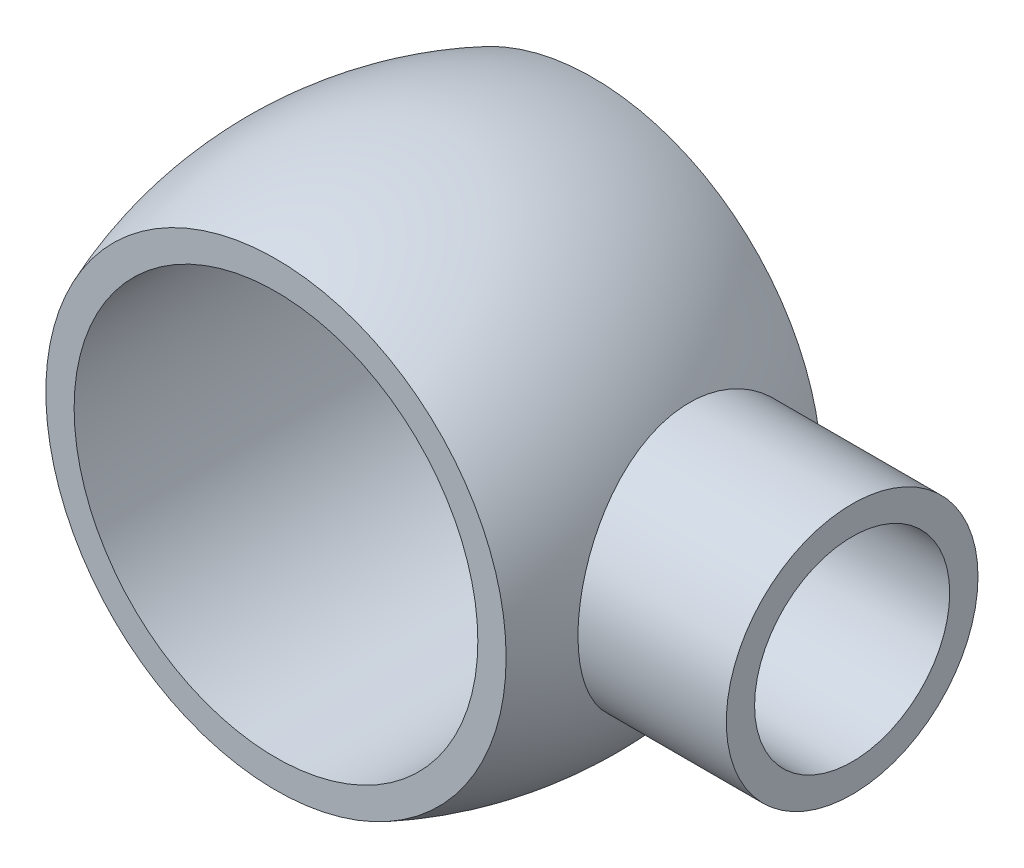
ISO-10303-21;
HEADER;
FILE_DESCRIPTION(('STEP AP214'),'2;1');
FILE_NAME('part.step','',(''),(''),'','','');
FILE_SCHEMA(('AUTOMOTIVE_DESIGN { 1 0 10303 214 1 1 1 1 }'));
ENDSEC;
DATA;
#1=APPLICATION_CONTEXT('core data for automotive mechanical design processes');
#2=APPLICATION_PROTOCOL_DEFINITION('international standard','automotive_design',2000,#1);
#3=PRODUCT_CONTEXT('',#1,'mechanical');
#4=PRODUCT('Part','Part','',(#3));
#5=PRODUCT_RELATED_PRODUCT_CATEGORY('part','',(#4));
#6=PRODUCT_DEFINITION_FORMATION('','',#4);
#7=PRODUCT_DEFINITION_CONTEXT('part definition',#1,'design');
#8=PRODUCT_DEFINITION('design','',#6,#7);
#9=PRODUCT_DEFINITION_SHAPE('','',#8);
#10=(LENGTH_UNIT() NAMED_UNIT(*) SI_UNIT(.MILLI.,.METRE.));
#11=(NAMED_UNIT(*) PLANE_ANGLE_UNIT() SI_UNIT($,.RADIAN.));
#12=(NAMED_UNIT(*) SI_UNIT($,.STERADIAN.) SOLID_ANGLE_UNIT());
#13=UNCERTAINTY_MEASURE_WITH_UNIT(LENGTH_MEASURE(1.E-05),#10,'distance_accuracy_value','');
#14=(GEOMETRIC_REPRESENTATION_CONTEXT(3) GLOBAL_UNCERTAINTY_ASSIGNED_CONTEXT((#13)) GLOBAL_UNIT_ASSIGNED_CONTEXT((#10,
#11,#12)) REPRESENTATION_CONTEXT('',''));
#15=CARTESIAN_POINT('',(0.,0.,0.));
#16=DIRECTION('',(0.,0.,1.));
#17=DIRECTION('',(1.,0.,0.));
#18=AXIS2_PLACEMENT_3D('',#15,#16,#17);
#19=CARTESIAN_POINT('',(0.,0.,-28.448));
#20=DIRECTION('',(0.,0.,-1.));
#21=DIRECTION('',(-1.,0.,0.));
#22=AXIS2_PLACEMENT_3D('',#19,#20,#21);
#23=PLANE('',#22);
#24=CARTESIAN_POINT('',(0.,0.,-28.448));
#25=DIRECTION('',(0.,0.,1.));
#26=DIRECTION('',(1.,0.,0.));
#27=AXIS2_PLACEMENT_3D('',#24,#25,#26);
#28=CIRCLE('',#27,36.2585);
#29=CARTESIAN_POINT('',(36.2585,0.,-28.448));
#30=VERTEX_POINT('',#29);
#31=EDGE_CURVE('E57',#30,#30,#28,.T.);
#32=ORIENTED_EDGE('',*,*,#31,.T.);
#33=EDGE_LOOP('',(#32));
#34=FACE_BOUND('',#33,.T.);
#35=CARTESIAN_POINT('',(0.,0.,-28.448));
#36=DIRECTION('',(0.,0.,1.));
#37=DIRECTION('',(1.,0.,0.));
#38=AXIS2_PLACEMENT_3D('',#35,#36,#37);
#39=CIRCLE('',#38,41.1132766541674);
#40=CARTESIAN_POINT('',(41.1132766541674,0.,-28.448));
#41=VERTEX_POINT('',#40);
#42=EDGE_CURVE('E62',#41,#41,#39,.T.);
#43=ORIENTED_EDGE('',*,*,#42,.F.);
#44=EDGE_LOOP('',(#43));
#45=FACE_BOUND('',#44,.T.);
#46=ADVANCED_FACE('F37',(#34,#45),#23,.T.);
#47=CARTESIAN_POINT('',(0.,0.,0.279826581228208));
#48=DIRECTION('',(0.,0.,1.));
#49=DIRECTION('',(1.,0.,0.));
#50=AXIS2_PLACEMENT_3D('',#47,#48,#49);
#51=DEGENERATE_TOROIDAL_SURFACE('',#50,29.464,76.2,.F.);
#52=CARTESIAN_POINT('',(43.1603121786938,-12.4393993128797,-16.2695883976753));
#53=CARTESIAN_POINT('',(43.1413822338452,-12.7841490575141,-15.9222381524418));
#54=CARTESIAN_POINT('',(43.123399931474,-13.1142930353611,-15.5604788709335));
#55=CARTESIAN_POINT('',(43.0902791287243,-13.7433122747584,-14.8104171236534));
#56=CARTESIAN_POINT('',(43.0751411768528,-14.0421815003467,-14.4221095579393));
#57=CARTESIAN_POINT('',(43.0486160935451,-14.6066384657564,-13.6214373372335));
#58=CARTESIAN_POINT('',(43.0372319952719,-14.8721991850462,-13.2090535434468));
#59=CARTESIAN_POINT('',(43.019059762729,-15.3678617205108,-12.3634240462649));
#60=CARTESIAN_POINT('',(43.0122713994767,-15.597965302897,-11.9301793834153));
#61=CARTESIAN_POINT('',(43.0040059273466,-16.0210740236935,-11.0458840477513));
#62=CARTESIAN_POINT('',(43.0025288579481,-16.2140788863361,-10.5948332426078));
#63=CARTESIAN_POINT('',(43.005463744434,-16.5616042050872,-9.67815195015388));
#64=CARTESIAN_POINT('',(43.0098757700079,-16.7161242057525,-9.21252129037379));
#65=CARTESIAN_POINT('',(43.0250051171025,-16.9855470434209,-8.2701474575391));
#66=CARTESIAN_POINT('',(43.0357210363975,-17.1004586818174,-7.79340677841715));
#67=CARTESIAN_POINT('',(43.0636988005645,-17.2899172038218,-6.8321630383389));
#68=CARTESIAN_POINT('',(43.0809606001094,-17.3644643669254,-6.34766003115521));
#69=CARTESIAN_POINT('',(43.121975326741,-17.4724233296553,-5.37702000721974));
#70=CARTESIAN_POINT('',(43.1456927291487,-17.5060549006414,-4.89090591060219));
#71=CARTESIAN_POINT('',(43.19952947992,-17.5327549300431,-3.9179224460597));
#72=CARTESIAN_POINT('',(43.2296488061444,-17.5258235287319,-3.43105308075242));
#73=CARTESIAN_POINT('',(43.2959820480743,-17.4715426114785,-2.45997187524868));
#74=CARTESIAN_POINT('',(43.3321962335966,-17.4241913057866,-1.97576015368534));
#75=CARTESIAN_POINT('',(43.410239656935,-17.289508297146,-1.0133892935498));
#76=CARTESIAN_POINT('',(43.4520689264363,-17.2021763685857,-0.535230189148312));
#77=CARTESIAN_POINT('',(43.5408923426659,-16.9878059106755,0.413705346150005));
#78=CARTESIAN_POINT('',(43.5879071151687,-16.8606048154592,0.884443111152988));
#79=CARTESIAN_POINT('',(43.6861803975891,-16.567598008645,1.81328711156837));
#80=CARTESIAN_POINT('',(43.7374389142139,-16.4017922360313,2.27139332701495));
#81=CARTESIAN_POINT('',(43.8433079445948,-16.0327853927215,3.17192377755698));
#82=CARTESIAN_POINT('',(43.897918703202,-15.8295815882643,3.61434686340884));
#83=CARTESIAN_POINT('',(44.009499612589,-15.3872277560815,4.48053205019941));
#84=CARTESIAN_POINT('',(44.0664697882703,-15.1480773489032,4.90429395408945));
#85=CARTESIAN_POINT('',(44.1825370264354,-14.6317933714797,5.73628128093671));
#86=CARTESIAN_POINT('',(44.2416528779105,-14.3541640141833,6.14419651543433));
#87=CARTESIAN_POINT('',(44.3600661695293,-13.7655271189254,6.93516313403366));
#88=CARTESIAN_POINT('',(44.4193636114548,-13.4545192524161,7.31821427333618));
#89=CARTESIAN_POINT('',(44.5369618020648,-12.8012237661529,8.05684579774082));
#90=CARTESIAN_POINT('',(44.5952625003648,-12.4589345706746,8.41242479733089));
#91=CARTESIAN_POINT('',(44.7096822070007,-11.7453999429631,9.09362171449635));
#92=CARTESIAN_POINT('',(44.7658012142713,-11.374154496592,9.41923961744299));
#93=CARTESIAN_POINT('',(44.8750182741524,-10.6029643079104,10.0400198652633));
#94=CARTESIAN_POINT('',(44.9280967640446,-10.2028645810448,10.334993184919));
#95=CARTESIAN_POINT('',(45.0297476645814,-9.37865568639202,10.8901327143833));
#96=CARTESIAN_POINT('',(45.0783200476117,-8.95454637149593,11.1502987108915));
#97=CARTESIAN_POINT('',(45.1699048295993,-8.08530572463559,11.6338439617367));
#98=CARTESIAN_POINT('',(45.2129175625603,-7.64017565771835,11.8572254261776));
#99=CARTESIAN_POINT('',(45.2924388343674,-6.73203407025935,12.2654822283076));
#100=CARTESIAN_POINT('',(45.328947463338,-6.26902279759801,12.4503580995582));
#101=CARTESIAN_POINT('',(45.3942207726193,-5.33452567607111,12.7780047750319));
#102=CARTESIAN_POINT('',(45.4230790933663,-4.86322565567117,12.9212869754046));
#103=CARTESIAN_POINT('',(45.4730237716509,-3.90984826597138,13.1677493084902));
#104=CARTESIAN_POINT('',(45.4941101865628,-3.42777097626014,13.2709297372456));
#105=CARTESIAN_POINT('',(45.5280372252163,-2.45640281079914,13.4363391040699));
#106=CARTESIAN_POINT('',(45.5408786759184,-1.96711266352802,13.49857214913));
#107=CARTESIAN_POINT('',(45.5580290695727,-0.984881371785242,13.581587673435));
#108=CARTESIAN_POINT('',(45.5623381104552,-0.491940269282411,13.6023706284212));
#109=CARTESIAN_POINT('',(45.5623268342831,0.485366673651553,13.6023156878541));
#110=CARTESIAN_POINT('',(45.5581551318467,0.96973271475107,13.5821945857838));
#111=CARTESIAN_POINT('',(45.5415713971376,1.9349893895929,13.5019283429501));
#112=CARTESIAN_POINT('',(45.5291594717976,2.41588006835284,13.4417837215689));
#113=CARTESIAN_POINT('',(45.496366156617,3.37075674611305,13.2819527522765));
#114=CARTESIAN_POINT('',(45.4759849035599,3.84474286347673,13.1822670830381));
#115=CARTESIAN_POINT('',(45.4276936295133,4.78248365623515,12.9441390428942));
#116=CARTESIAN_POINT('',(45.3997835729899,5.24623828332903,12.8056964890673));
#117=CARTESIAN_POINT('',(45.3370585061375,6.15990375554059,12.4912593135974));
#118=CARTESIAN_POINT('',(45.3022494380327,6.60982613202078,12.3152969984765));
#119=CARTESIAN_POINT('',(45.2264441748429,7.49317981548803,11.9270745760422));
#120=CARTESIAN_POINT('',(45.1854479975888,7.92661116999654,11.7148145733361));
#121=CARTESIAN_POINT('',(45.0981146124393,8.77411900629546,11.2555337144418));
#122=CARTESIAN_POINT('',(45.0517770299523,9.18819412777142,11.0085104200424));
#123=CARTESIAN_POINT('',(44.9547066656505,9.99424141561001,10.4814703470165));
#124=CARTESIAN_POINT('',(44.9039738242078,10.3862132819914,10.2014531207618));
#125=CARTESIAN_POINT('',(44.7982612231518,11.1517922893715,9.60547445440995));
#126=CARTESIAN_POINT('',(44.7432251240459,11.5249887560021,9.28899536630632));
#127=CARTESIAN_POINT('',(44.6307787605653,12.2434393444088,8.62615410358728));
#128=CARTESIAN_POINT('',(44.5733684723687,12.5886931857124,8.27979162909127));
#129=CARTESIAN_POINT('',(44.4573156911245,13.2489989650672,7.55952273325268));
#130=CARTESIAN_POINT('',(44.3986730964071,13.5640483991187,7.18561403281465));
#131=CARTESIAN_POINT('',(44.2813114675746,14.1618154937612,6.41279813193527));
#132=CARTESIAN_POINT('',(44.2225924329185,14.44453292428,6.01389075363628));
#133=CARTESIAN_POINT('',(44.1053706835193,14.979557118483,5.18782867045793));
#134=CARTESIAN_POINT('',(44.0468832884731,15.2313667641714,4.76034966945782));
#135=CARTESIAN_POINT('',(43.9321317666932,15.6979599219389,3.88534852237713));
#136=CARTESIAN_POINT('',(43.8758676645063,15.9127430253055,3.43782615511924));
#137=CARTESIAN_POINT('',(43.7666300129073,16.3037054121172,2.52583921196006));
#138=CARTESIAN_POINT('',(43.7136564278049,16.4798851143231,2.06137481990569));
#139=CARTESIAN_POINT('',(43.6119694799914,16.7923010135292,1.11874659715292));
#140=CARTESIAN_POINT('',(43.5632560844942,16.9285375179474,0.64058287192085));
#141=CARTESIAN_POINT('',(43.4711071585317,17.1595554108494,-0.32428088015757));
#142=CARTESIAN_POINT('',(43.4276528681552,17.2544874850479,-0.81094302512437));
#143=CARTESIAN_POINT('',(43.3465093061573,17.4028227556151,-1.7910349758521));
#144=CARTESIAN_POINT('',(43.3088200306101,17.4562259802639,-2.28446477700419));
#145=CARTESIAN_POINT('',(43.2397389868423,17.5209960494837,-3.27447805857188));
#146=CARTESIAN_POINT('',(43.2083467248076,17.5323661915253,-3.77106128854109));
#147=CARTESIAN_POINT('',(43.1522036207596,17.5128905213501,-4.76377440438291));
#148=CARTESIAN_POINT('',(43.127452702159,17.4820451959833,-5.25990429541763));
#149=CARTESIAN_POINT('',(43.0850531523149,17.3790322736294,-6.24090578752679));
#150=CARTESIAN_POINT('',(43.0673072055342,17.3074672693543,-6.72583654713037));
#151=CARTESIAN_POINT('',(43.0383716184629,17.1239289205765,-7.68818605300253));
#152=CARTESIAN_POINT('',(43.0271819144045,17.011955969109,-8.16560487229023));
#153=CARTESIAN_POINT('',(43.0111305471142,16.7483772027527,-9.10946655848653));
#154=CARTESIAN_POINT('',(43.0062687076418,16.5967724918091,-9.57590973072802));
#155=CARTESIAN_POINT('',(43.0024674065451,16.2550050959875,-10.4944732774221));
#156=CARTESIAN_POINT('',(43.0035279440486,16.0648424167887,-10.9465936539842));
#157=CARTESIAN_POINT('',(43.010984418936,15.6484835178556,-11.8308132035499));
#158=CARTESIAN_POINT('',(43.0173507452386,15.4224929059629,-12.2630094750342));
#159=CARTESIAN_POINT('',(43.0346861214565,14.9353374999397,-13.106999547539));
#160=CARTESIAN_POINT('',(43.045655148534,14.6741728803415,-13.5187934497815));
#161=CARTESIAN_POINT('',(43.0713902998829,14.1185034252804,-14.3191308336515));
#162=CARTESIAN_POINT('',(43.0861565699915,13.8239973095445,-14.7076734215805));
#163=CARTESIAN_POINT('',(43.1185953892356,13.2037161292881,-15.4588120486675));
#164=CARTESIAN_POINT('',(43.1362679595289,12.8779408371364,-15.8214078989069));
#165=CARTESIAN_POINT('',(43.1737067614802,12.1949603991845,-16.5206472697281));
#166=CARTESIAN_POINT('',(43.1934870101439,11.8375479000051,-16.8570875261574));
#167=CARTESIAN_POINT('',(43.2340452357928,11.0958054165953,-17.4987914183331));
#168=CARTESIAN_POINT('',(43.2548232168753,10.7114753218247,-17.8040549260359));
#169=CARTESIAN_POINT('',(43.2963928212259,9.9185642473451,-18.3812931894848));
#170=CARTESIAN_POINT('',(43.3171844448569,9.50998259423162,-18.653267020218));
#171=CARTESIAN_POINT('',(43.3578336412837,8.67141956780339,-19.1620186484544));
#172=CARTESIAN_POINT('',(43.3776912120823,8.24143814873479,-19.3987963707021));
#173=CARTESIAN_POINT('',(43.4156971874154,7.3606484512306,-19.8366939350191));
#174=CARTESIAN_POINT('',(43.4338355782942,6.90973852723211,-20.0376102471212));
#175=CARTESIAN_POINT('',(43.4674824757069,5.99249377007548,-20.4007318561513));
#176=CARTESIAN_POINT('',(43.4829909710038,5.52615887102027,-20.5629369876769));
#177=CARTESIAN_POINT('',(43.5107057486474,4.58140356611779,-20.8474503649449));
#178=CARTESIAN_POINT('',(43.5229122117844,4.10298382349923,-20.9697607950463));
#179=CARTESIAN_POINT('',(43.5435002300466,3.13745365787838,-21.1735992821733));
#180=CARTESIAN_POINT('',(43.5518818057565,2.65034328166189,-21.2551275586799));
#181=CARTESIAN_POINT('',(43.564439196169,1.67274989966487,-21.3765734600012));
#182=CARTESIAN_POINT('',(43.5686305374352,1.18228617603193,-21.4166447197207));
#183=CARTESIAN_POINT('',(43.5726850466647,0.199707168365994,-21.4554149040075));
#184=CARTESIAN_POINT('',(43.5725482109027,-0.292408117088135,-21.4541137929657));
#185=CARTESIAN_POINT('',(43.5679516869232,-1.27485423142427,-21.4101446817866));
#186=CARTESIAN_POINT('',(43.5634912293594,-1.76518472713401,-21.3674693195068));
#187=CARTESIAN_POINT('',(43.5504348431747,-2.74046080086136,-21.2410568275058));
#188=CARTESIAN_POINT('',(43.5418389673279,-3.2254064475171,-21.1573202217887));
#189=CARTESIAN_POINT('',(43.5209046046151,-4.18515311184183,-20.9496832144505));
#190=CARTESIAN_POINT('',(43.5085763826437,-4.65997817745005,-20.8258929072314));
#191=CARTESIAN_POINT('',(43.4806914926601,-5.59751368798929,-20.5389772673418));
#192=CARTESIAN_POINT('',(43.4651346718976,-6.06022355856364,-20.3758500735193));
#193=CARTESIAN_POINT('',(43.4314712187996,-6.96990372393707,-20.0115698620016));
#194=CARTESIAN_POINT('',(43.4133666729527,-7.41688652785141,-19.8104479148436));
#195=CARTESIAN_POINT('',(43.3753898689584,-8.29225818403341,-19.3715989417986));
#196=CARTESIAN_POINT('',(43.3555179519686,-8.7206506011705,-19.1338789740182));
#197=CARTESIAN_POINT('',(43.3060139974536,-9.73811146291184,-18.5121275943854));
#198=CARTESIAN_POINT('',(43.2759006931023,-10.3158953715289,-18.109466417359));
#199=CARTESIAN_POINT('',(43.2166440271184,-11.4189627825623,-17.2376412363612));
#200=CARTESIAN_POINT('',(43.1875006719128,-11.9442459371475,-16.7684767918382));
#201=CARTESIAN_POINT('',(43.1603121786938,-12.4393993128797,-16.2695883976753));
#202=B_SPLINE_CURVE_WITH_KNOTS('',3,(#52,#53,#54,#55,#56,#57,#58,#59,#60,#61,#62,#63,#64,#65,
#66,#67,#68,#69,#70,#71,#72,#73,#74,#75,#76,#77,#78,#79,#80,#81,#82,#83,#84,#85,#86,#87,#88,#89,
#90,#91,#92,#93,#94,#95,#96,#97,#98,#99,#100,#101,#102,#103,#104,#105,#106,#107,#108,#109,#110,
#111,#112,#113,#114,#115,#116,#117,#118,#119,#120,#121,#122,#123,#124,#125,#126,#127,#128,#129,
#130,#131,#132,#133,#134,#135,#136,#137,#138,#139,#140,#141,#142,#143,#144,#145,#146,#147,#148,
#149,#150,#151,#152,#153,#154,#155,#156,#157,#158,#159,#160,#161,#162,#163,#164,#165,#166,#167,
#168,#169,#170,#171,#172,#173,#174,#175,#176,#177,#178,#179,#180,#181,#182,#183,#184,#185,#186,
#187,#188,#189,#190,#191,#192,#193,#194,#195,#196,#197,#198,#199,#200,#201),.UNSPECIFIED.,.T.,
.F.,(4,2,2,2,2,2,2,2,2,2,2,2,2,2,2,2,2,2,2,2,2,2,2,2,2,2,2,2,2,2,2,2,2,2,2,2,2,2,2,2,2,2,2,2,2,
2,2,2,2,2,2,2,2,2,2,2,2,2,2,2,2,2,2,2,2,2,2,2,2,2,2,2,2,2,4),(0.,1.46867296499704,
2.93762886005812,4.40776879874042,5.87783548227106,7.34791309289609,8.81800810010744,
10.2877762258795,11.7575341744073,13.2193622013585,14.681185173077,16.1430728760911,
17.6049688286721,19.0729049321028,20.5408433556668,22.0088891268102,23.4769503957458,
24.9660771697615,26.4552186027362,27.9444350891439,29.4336523026694,30.93156912525,
32.4294951266984,33.9273310962625,35.4251463093406,36.9036795790329,38.3822019335718,
39.8605759708347,41.3389330400388,42.7916070752322,44.2442622595613,45.6968925119588,
47.1495296204731,48.6009209455888,50.0523080879776,51.5037970778564,52.9553057623341,
54.4308080110408,55.906325068175,57.3819643427441,58.8576141172095,60.3545354501241,
61.8514733055454,63.3483949217278,64.8453050167331,66.3367073759715,67.828108719603,
69.3193930611931,70.8106602046895,72.2804122646255,73.7501500291382,75.2198468583778,
76.689543471154,78.1510923531336,79.6126339832201,81.0742317537756,82.5358401651694,
84.0078600189098,85.4798859180252,86.9519527107213,88.42402265091,89.9041985590034,
91.3843807913766,92.8644819655585,94.3445751740564,95.8191634645107,97.2937530241391,
98.768605020692,100.243438196375,101.714251498151,103.185134402394,104.654819645754,
106.124221807389,108.233617304046,110.343026775069),.UNSPECIFIED.);
#203=CARTESIAN_POINT('',(43.1603121786938,-12.4393993128797,-16.2695883976753));
#204=VERTEX_POINT('',#203);
#205=EDGE_CURVE('E65',#204,#204,#202,.T.);
#206=ORIENTED_EDGE('',*,*,#205,.F.);
#207=EDGE_LOOP('',(#206));
#208=FACE_BOUND('',#207,.T.);
#209=ADVANCED_FACE('F81',(#208),#51,.F.);
#210=CARTESIAN_POINT('',(-46.738,0.,-3.92365705432462));
#211=DIRECTION('',(1.,0.,0.));
#212=DIRECTION('',(0.,0.,-1.));
#213=AXIS2_PLACEMENT_3D('',#210,#211,#212);
#214=CYLINDRICAL_SURFACE('',#213,17.526);
#215=ORIENTED_EDGE('',*,*,#205,.T.);
#216=EDGE_LOOP('',(#215));
#217=FACE_BOUND('',#216,.T.);
#218=CARTESIAN_POINT('',(71.12,0.,-3.92365705432462));
#219=DIRECTION('',(1.,0.,0.));
#220=DIRECTION('',(0.,0.,-1.));
#221=AXIS2_PLACEMENT_3D('',#218,#219,#220);
#222=CIRCLE('',#221,17.526);
#223=CARTESIAN_POINT('',(71.12,0.,-21.4496570543246));
#224=VERTEX_POINT('',#223);
#225=EDGE_CURVE('E177',#224,#224,#222,.T.);
#226=ORIENTED_EDGE('',*,*,#225,.T.);
#227=EDGE_LOOP('',(#226));
#228=FACE_BOUND('',#227,.T.);
#229=ADVANCED_FACE('F75',(#217,#228),#214,.F.);
#230=CARTESIAN_POINT('',(71.12,0.,-3.92365705432462));
#231=DIRECTION('',(1.,0.,0.));
#232=DIRECTION('',(0.,0.,-1.));
#233=AXIS2_PLACEMENT_3D('',#230,#231,#232);
#234=PLANE('',#233);
#235=CARTESIAN_POINT('',(71.12,0.,-3.92365705432462));
#236=DIRECTION('',(1.,0.,0.));
#237=DIRECTION('',(0.,0.,-1.));
#238=AXIS2_PLACEMENT_3D('',#235,#236,#237);
#239=CIRCLE('',#238,22.606);
#240=CARTESIAN_POINT('',(71.12,0.,-26.5296570543246));
#241=VERTEX_POINT('',#240);
#242=EDGE_CURVE('E73',#241,#241,#239,.T.);
#243=ORIENTED_EDGE('',*,*,#242,.T.);
#244=EDGE_LOOP('',(#243));
#245=FACE_BOUND('',#244,.T.);
#246=ORIENTED_EDGE('',*,*,#225,.F.);
#247=EDGE_LOOP('',(#246));
#248=FACE_BOUND('',#247,.T.);
#249=ADVANCED_FACE('F89',(#245,#248),#234,.T.);
#250=CARTESIAN_POINT('',(0.,0.,28.448));
#251=DIRECTION('',(0.,0.,-1.));
#252=DIRECTION('',(-1.,0.,0.));
#253=AXIS2_PLACEMENT_3D('',#250,#251,#252);
#254=PLANE('',#253);
#255=CARTESIAN_POINT('',(0.,0.,28.448));
#256=DIRECTION('',(0.,0.,1.));
#257=DIRECTION('',(1.,0.,0.));
#258=AXIS2_PLACEMENT_3D('',#255,#256,#257);
#259=CIRCLE('',#258,36.2585);
#260=CARTESIAN_POINT('',(36.2585,0.,28.448));
#261=VERTEX_POINT('',#260);
#262=EDGE_CURVE('E53',#261,#261,#259,.T.);
#263=ORIENTED_EDGE('',*,*,#262,.F.);
#264=EDGE_LOOP('',(#263));
#265=FACE_BOUND('',#264,.T.);
#266=CARTESIAN_POINT('',(0.,0.,28.448));
#267=DIRECTION('',(0.,0.,1.));
#268=DIRECTION('',(1.,0.,0.));
#269=AXIS2_PLACEMENT_3D('',#266,#267,#268);
#270=CIRCLE('',#269,41.3385);
#271=CARTESIAN_POINT('',(41.3385,0.,28.448));
#272=VERTEX_POINT('',#271);
#273=EDGE_CURVE('E49',#272,#272,#270,.T.);
#274=ORIENTED_EDGE('',*,*,#273,.T.);
#275=EDGE_LOOP('',(#274));
#276=FACE_BOUND('',#275,.T.);
#277=ADVANCED_FACE('F86',(#265,#276),#254,.F.);
#278=CARTESIAN_POINT('',(-46.738,0.,-3.92365705432462));
#279=DIRECTION('',(1.,0.,0.));
#280=DIRECTION('',(0.,0.,-1.));
#281=AXIS2_PLACEMENT_3D('',#278,#279,#280);
#282=CYLINDRICAL_SURFACE('',#281,22.606);
#283=CARTESIAN_POINT('',(41.0164474013598,-15.8923510714288,-20.0004855171296));
#284=CARTESIAN_POINT('',(41.0592298858627,-15.4408450352024,-20.4468062791672));
#285=CARTESIAN_POINT('',(41.1032677407014,-14.9705327350692,-20.8740934935921));
#286=CARTESIAN_POINT('',(41.1920052415346,-13.9956076583141,-21.6875930672911));
#287=CARTESIAN_POINT('',(41.2367050005334,-13.490988970637,-22.0737983185152));
#288=CARTESIAN_POINT('',(41.3249769835979,-12.4505807405401,-22.8026921931062));
#289=CARTESIAN_POINT('',(41.3685483556245,-11.9147685817499,-23.1453486544066));
#290=CARTESIAN_POINT('',(41.4527873377478,-10.8160381656716,-23.7843830945495));
#291=CARTESIAN_POINT('',(41.4934550779155,-10.2531211244661,-24.0807631470941));
#292=CARTESIAN_POINT('',(41.5702897469352,-9.10399685267487,-24.6251721769328));
#293=CARTESIAN_POINT('',(41.6064561904263,-8.51778711948464,-24.873195941747));
#294=CARTESIAN_POINT('',(41.6728662400202,-7.32623768354312,-25.3190331159371));
#295=CARTESIAN_POINT('',(41.7031097853079,-6.72089778444105,-25.5168460097636));
#296=CARTESIAN_POINT('',(41.7564850209508,-5.49554308318638,-25.8607278793763));
#297=CARTESIAN_POINT('',(41.7796184417171,-4.87553189125092,-26.0068094464805));
#298=CARTESIAN_POINT('',(41.8178795894073,-3.6251576102559,-26.246171214977));
#299=CARTESIAN_POINT('',(41.8330074010442,-2.99479463080891,-26.3394519750936));
#300=CARTESIAN_POINT('',(41.8545784433547,-1.73345775408596,-26.4719433560839));
#301=CARTESIAN_POINT('',(41.8610913804246,-1.10253061824724,-26.5115880284706));
#302=CARTESIAN_POINT('',(41.8654100383243,0.160456486551816,-26.5379101018655));
#303=CARTESIAN_POINT('',(41.8632157985477,0.792516450373984,-26.5245877425116));
#304=CARTESIAN_POINT('',(41.8502045352625,2.05321364110527,-26.445079631969));
#305=CARTESIAN_POINT('',(41.8393874789921,2.68185085500078,-26.378893679929));
#306=CARTESIAN_POINT('',(41.8095466448673,3.93118544035859,-26.1941702263062));
#307=CARTESIAN_POINT('',(41.7905228793445,4.55188282374997,-26.0756328033876));
#308=CARTESIAN_POINT('',(41.7451421111142,5.77708501032894,-25.7880121704511));
#309=CARTESIAN_POINT('',(41.7188315498184,6.3816666211913,-25.6192485781301));
#310=CARTESIAN_POINT('',(41.6598268024989,7.57442340067956,-25.2321641177634));
#311=CARTESIAN_POINT('',(41.6271326487581,8.16259865225812,-25.0138435003353));
#312=CARTESIAN_POINT('',(41.556600320479,9.31855071611274,-24.5292061308213));
#313=CARTESIAN_POINT('',(41.5187618195616,9.88632623125201,-24.2628863331164));
#314=CARTESIAN_POINT('',(41.439385664097,10.9975993330168,-23.6841359668189));
#315=CARTESIAN_POINT('',(41.3978479715849,11.5410966703891,-23.3717049249642));
#316=CARTESIAN_POINT('',(41.3122301529577,12.605653817514,-22.6994162535255));
#317=CARTESIAN_POINT('',(41.2681281369522,13.126422670728,-22.3391006105338));
#318=CARTESIAN_POINT('',(41.179538291429,14.1358907137429,-21.5760830349619));
#319=CARTESIAN_POINT('',(41.1350504593581,14.6245896911248,-21.1733808216746));
#320=CARTESIAN_POINT('',(41.0475041584191,15.5665875380176,-20.3283202449773));
#321=CARTESIAN_POINT('',(41.0044457545736,16.0198847984262,-19.8859600809685));
#322=CARTESIAN_POINT('',(40.92158203341,16.8879133917882,-18.9646080870876));
#323=CARTESIAN_POINT('',(40.881776720427,17.3026446733482,-18.4856162084013));
#324=CARTESIAN_POINT('',(40.8069557441983,18.0930990750983,-17.4911537106277));
#325=CARTESIAN_POINT('',(40.7719717456819,18.4685607350255,-16.9754728043295));
#326=CARTESIAN_POINT('',(40.7087871524543,19.1747462616634,-15.9139335162934));
#327=CARTESIAN_POINT('',(40.6805865951682,19.5054698815442,-15.368074968082));
#328=CARTESIAN_POINT('',(40.6325005564331,20.1196977647759,-14.2501149384192));
#329=CARTESIAN_POINT('',(40.6126143192016,20.4032063186265,-13.6780158475154));
#330=CARTESIAN_POINT('',(40.582460516135,20.9209037237971,-12.5116774198505));
#331=CARTESIAN_POINT('',(40.5721928113799,21.1550932873905,-11.917438402984));
#332=CARTESIAN_POINT('',(40.5623757444169,21.5695795441527,-10.7193093936716));
#333=CARTESIAN_POINT('',(40.5626841815576,21.7505582587341,-10.1156564518829));
#334=CARTESIAN_POINT('',(40.5743610887813,22.0614793248536,-8.89545211808149));
#335=CARTESIAN_POINT('',(40.585729462316,22.1914221218986,-8.27890083871166));
#336=CARTESIAN_POINT('',(40.6198923574604,22.3993646753855,-7.03746118789152));
#337=CARTESIAN_POINT('',(40.6426860278931,22.4773683002526,-6.41257344087757));
#338=CARTESIAN_POINT('',(40.6997273379608,22.5809815408038,-5.15899275389841));
#339=CARTESIAN_POINT('',(40.7339749202923,22.6065914186076,-4.53029983298582));
#340=CARTESIAN_POINT('',(40.8131401517814,22.6053949726872,-3.28115387943866));
#341=CARTESIAN_POINT('',(40.8579261092671,22.5792081800491,-2.66069174419516));
#342=CARTESIAN_POINT('',(40.957770913206,22.4760248884588,-1.42485188468768));
#343=CARTESIAN_POINT('',(41.0128296576087,22.3990288942297,-0.80947410997868));
#344=CARTESIAN_POINT('',(41.1323375036422,22.194966873351,0.412024797633817));
#345=CARTESIAN_POINT('',(41.1967871389982,22.0678980001428,1.01814540224763));
#346=CARTESIAN_POINT('',(41.3339438947506,21.7647708623167,2.21705303791101));
#347=CARTESIAN_POINT('',(41.4066511361748,21.5887118796193,2.8098398733813));
#348=CARTESIAN_POINT('',(41.5600064364611,21.1863047780127,3.98603426814918));
#349=CARTESIAN_POINT('',(41.6407477115755,20.9593154272616,4.56921027474159));
#350=CARTESIAN_POINT('',(41.8077752461955,20.4581431208855,5.7140870628001));
#351=CARTESIAN_POINT('',(41.8940615435251,20.1839598433172,6.27578769773542));
#352=CARTESIAN_POINT('',(42.0704965519653,19.5903021181642,7.37417777559865));
#353=CARTESIAN_POINT('',(42.1606457594321,19.2708218379919,7.91086398574543));
#354=CARTESIAN_POINT('',(42.3430108039089,18.5887518737403,8.95573746681091));
#355=CARTESIAN_POINT('',(42.4352266725301,18.2261615298985,9.46392430139593));
#356=CARTESIAN_POINT('',(42.6221055102009,17.4510148155234,10.4604064128183));
#357=CARTESIAN_POINT('',(42.7167740057354,17.0374666751508,10.9479296200307));
#358=CARTESIAN_POINT('',(42.9043485342889,16.1703878409157,11.8864013126166));
#359=CARTESIAN_POINT('',(42.997254536801,15.7168564557501,12.33734916535));
#360=CARTESIAN_POINT('',(43.1793217096734,14.7727834484914,13.1995665734852));
#361=CARTESIAN_POINT('',(43.2684827120323,14.2822401687928,13.610834349903));
#362=CARTESIAN_POINT('',(43.4411201863933,13.2674087528814,14.3907258374783));
#363=CARTESIAN_POINT('',(43.5245966930817,12.7431208226148,14.7593498088558));
#364=CARTESIAN_POINT('',(43.684159092658,11.6633827485854,15.4518112044586));
#365=CARTESIAN_POINT('',(43.7602320017441,11.1078804613232,15.7755703553916));
#366=CARTESIAN_POINT('',(43.9031028496277,9.97036283100068,16.3750230275958));
#367=CARTESIAN_POINT('',(43.9699007429149,9.38834735786511,16.6507163130207));
#368=CARTESIAN_POINT('',(44.092668377427,8.20201783999042,17.1517474434856));
#369=CARTESIAN_POINT('',(44.1486396796343,7.597707024786,17.3770925484747));
#370=CARTESIAN_POINT('',(44.2484444777167,6.37112991118836,17.7755530946904));
#371=CARTESIAN_POINT('',(44.2922782802518,5.74886406687694,17.9486698555031));
#372=CARTESIAN_POINT('',(44.3657966840142,4.50726734874306,18.2373782557837));
#373=CARTESIAN_POINT('',(44.3958167977261,3.8882740764043,18.3543373409141));
#374=CARTESIAN_POINT('',(44.44264549019,2.64219614797581,18.5362285029916));
#375=CARTESIAN_POINT('',(44.4594542895392,2.01511162716816,18.6011614486502));
#376=CARTESIAN_POINT('',(44.4794665496713,0.757572981692946,18.6784251125297));
#377=CARTESIAN_POINT('',(44.4826717168343,0.127119289573456,18.6907624281174));
#378=CARTESIAN_POINT('',(44.4754060009363,-1.13253349051472,18.6627429943526));
#379=CARTESIAN_POINT('',(44.4649352653035,-1.76173259193484,18.6223868130435));
#380=CARTESIAN_POINT('',(44.4309364064244,-3.00063843505066,18.4907811788551));
#381=CARTESIAN_POINT('',(44.40769561832,-3.61047241846242,18.4006514480024));
#382=CARTESIAN_POINT('',(44.3488781023145,-4.82016208306005,18.1710545349933));
#383=CARTESIAN_POINT('',(44.3133015897816,-5.42001793826145,18.0315882141985));
#384=CARTESIAN_POINT('',(44.230594171486,-6.60562752674045,17.7044522422924));
#385=CARTESIAN_POINT('',(44.1834630071648,-7.19138094412556,17.5167815125063));
#386=CARTESIAN_POINT('',(44.0786668109005,-8.34483207330554,17.0947200603659));
#387=CARTESIAN_POINT('',(44.0210016327108,-8.91252953429616,16.8603286893721));
#388=CARTESIAN_POINT('',(43.8957956429639,-10.0312101818669,16.3442719041694));
#389=CARTESIAN_POINT('',(43.8281697868966,-10.5819944061222,16.0621959424477));
#390=CARTESIAN_POINT('',(43.6848735254906,-11.6578107880491,15.4543821462635));
#391=CARTESIAN_POINT('',(43.6092030973651,-12.1828428727701,15.1286441881255));
#392=CARTESIAN_POINT('',(43.4513795543403,-13.203906662618,14.4357763868055));
#393=CARTESIAN_POINT('',(43.369225597158,-13.699934585159,14.0686411629896));
#394=CARTESIAN_POINT('',(43.2001180947325,-14.6598496975181,13.2955141586592));
#395=CARTESIAN_POINT('',(43.1131644549282,-15.1237362536953,12.8895216124796));
#396=CARTESIAN_POINT('',(42.9336740996777,-16.0292728973405,12.0292332051175));
#397=CARTESIAN_POINT('',(42.8410488670401,-16.469910293373,11.5738893515513));
#398=CARTESIAN_POINT('',(42.6545031252849,-17.311315156333,10.6279853993471));
#399=CARTESIAN_POINT('',(42.5605825920223,-17.7120818789039,10.1374246435291));
#400=CARTESIAN_POINT('',(42.3733810061983,-18.4711472205281,9.12427959856084));
#401=CARTESIAN_POINT('',(42.2801000208261,-18.8294414400503,8.60169200038793));
#402=CARTESIAN_POINT('',(42.0961020787884,-19.5010930686863,7.52796342997223));
#403=CARTESIAN_POINT('',(42.0053851313598,-19.8144503159332,6.97682235488695));
#404=CARTESIAN_POINT('',(41.8271029804754,-20.3981502726072,5.84157858893638));
#405=CARTESIAN_POINT('',(41.739600942279,-20.667817918037,5.25711861799671));
#406=CARTESIAN_POINT('',(41.5709492181644,-21.1566117712211,4.06653186968023));
#407=CARTESIAN_POINT('',(41.4897996130217,-21.3757373363689,3.46040481693508));
#408=CARTESIAN_POINT('',(41.3355167797533,-21.7616473336828,2.23078128068322));
#409=CARTESIAN_POINT('',(41.2623826763022,-21.9284374848025,1.60728670312581));
#410=CARTESIAN_POINT('',(41.1255665987765,-22.2082492524098,0.347328991184154));
#411=CARTESIAN_POINT('',(41.0618844338098,-22.3212719548902,-0.289133880996168));
#412=CARTESIAN_POINT('',(40.9461022217588,-22.4910756432507,-1.55996745748715));
#413=CARTESIAN_POINT('',(40.8938310902325,-22.54873900514,-2.19420469652125));
#414=CARTESIAN_POINT('',(40.8004187461533,-22.6103349163755,-3.46610539947257));
#415=CARTESIAN_POINT('',(40.7592774586081,-22.6142678277635,-4.10376884027468));
#416=CARTESIAN_POINT('',(40.6886380267056,-22.5681859881106,-5.37780692939012));
#417=CARTESIAN_POINT('',(40.6591401310879,-22.5181700846372,-6.01418154988127));
#418=CARTESIAN_POINT('',(40.6119541486732,-22.3644256799788,-7.28084230057664));
#419=CARTESIAN_POINT('',(40.5942657800136,-22.2606984608478,-7.91112857573991));
#420=CARTESIAN_POINT('',(40.5707668101918,-22.0031380707953,-9.14693580350512));
#421=CARTESIAN_POINT('',(40.5647003727211,-21.8504726524289,-9.75269566034328));
#422=CARTESIAN_POINT('',(40.5631585005776,-21.4955316483121,-10.9495340512786));
#423=CARTESIAN_POINT('',(40.5676833043501,-21.2932549457335,-11.5406122545385));
#424=CARTESIAN_POINT('',(40.586504878791,-20.8407044121113,-12.7034824204243));
#425=CARTESIAN_POINT('',(40.6007953627895,-20.5904615338828,-13.2752865424211));
#426=CARTESIAN_POINT('',(40.6380594794695,-20.0437145683299,-14.3959695688609));
#427=CARTESIAN_POINT('',(40.6610318371981,-19.7472172773237,-14.9448518262953));
#428=CARTESIAN_POINT('',(40.7082111180214,-19.1833629673264,-15.8927930135319));
#429=CARTESIAN_POINT('',(40.7309209354946,-18.9249694739293,-16.2972935385909));
#430=CARTESIAN_POINT('',(40.7800381630822,-18.3830270872623,-17.0889778037261));
#431=CARTESIAN_POINT('',(40.8064462667119,-18.0994734795447,-17.4761582778782));
#432=CARTESIAN_POINT('',(40.8622332943831,-17.5084188178235,-18.2315748897012));
#433=CARTESIAN_POINT('',(40.8916122877066,-17.2009172053838,-18.5998105852719));
#434=CARTESIAN_POINT('',(40.9525717980792,-16.5632968935078,-19.3158056083939));
#435=CARTESIAN_POINT('',(40.9841519207826,-16.233182245516,-19.6635685832695));
#436=CARTESIAN_POINT('',(41.0164474013598,-15.8923510714288,-20.0004855171296));
#437=B_SPLINE_CURVE_WITH_KNOTS('',3,(#283,#284,#285,#286,#287,#288,#289,#290,#291,#292,#293,
#294,#295,#296,#297,#298,#299,#300,#301,#302,#303,#304,#305,#306,#307,#308,#309,#310,#311,#312,
#313,#314,#315,#316,#317,#318,#319,#320,#321,#322,#323,#324,#325,#326,#327,#328,#329,#330,#331,
#332,#333,#334,#335,#336,#337,#338,#339,#340,#341,#342,#343,#344,#345,#346,#347,#348,#349,#350,
#351,#352,#353,#354,#355,#356,#357,#358,#359,#360,#361,#362,#363,#364,#365,#366,#367,#368,#369,
#370,#371,#372,#373,#374,#375,#376,#377,#378,#379,#380,#381,#382,#383,#384,#385,#386,#387,#388,
#389,#390,#391,#392,#393,#394,#395,#396,#397,#398,#399,#400,#401,#402,#403,#404,#405,#406,#407,
#408,#409,#410,#411,#412,#413,#414,#415,#416,#417,#418,#419,#420,#421,#422,#423,#424,#425,#426,
#427,#428,#429,#430,#431,#432,#433,#434,#435,#436),.UNSPECIFIED.,.T.,.F.,(4,2,2,2,2,2,2,2,2,2,2,
2,2,2,2,2,2,2,2,2,2,2,2,2,2,2,2,2,2,2,2,2,2,2,2,2,2,2,2,2,2,2,2,2,2,2,2,2,2,2,2,2,2,2,2,2,2,2,2,
2,2,2,2,2,2,2,2,2,2,2,2,2,2,2,2,2,4),(0.,1.90850453237723,3.81733874120402,5.72757458820357,
7.63772481063373,9.54808082060081,11.4584564447086,13.3683667664864,15.2782568777113,
17.1725968009305,19.0669281536233,20.9612667037158,22.8556024073523,24.7381321514881,
26.6206523755861,28.5032920904541,30.3859511291107,32.2881240344482,34.1903095378092,
36.0925814503119,37.9948558977654,39.9090823362622,41.8233193355499,43.7373822903899,
45.6514176001015,47.539728124931,49.428022165795,51.3161755509361,53.2043194898436,
55.0700162046381,56.9356943864504,58.8014786442189,60.6672902514261,62.5580615896175,
64.4488458266202,66.3398737485581,68.2309306147803,70.1674563559968,72.1040155859615,
74.0406615977272,75.977295791122,77.917267298336,79.8572483241959,81.7969494339531,
83.7366015316857,85.6262692379517,87.5159053906458,89.405304508633,91.2946832587938,
93.1431940414775,94.991672552822,96.8401924313552,98.6887379753439,100.554095126266,
102.419457561049,104.285062727488,106.150704662359,108.069600150455,109.988531456224,
111.907661361878,113.826798180239,115.773226373433,117.71967931271,119.665919479166,
121.612120333869,123.526758610808,125.441383986692,127.356050262829,129.270670839239,
131.142637100356,133.014645506255,134.885449938021,136.75597974458,138.196617816492,
139.637526404418,141.078468602511,142.519153307321),.UNSPECIFIED.);
#438=CARTESIAN_POINT('',(41.0164474013598,-15.8923510714288,-20.0004855171296));
#439=VERTEX_POINT('',#438);
#440=EDGE_CURVE('E10',#439,#439,#437,.T.);
#441=ORIENTED_EDGE('',*,*,#440,.T.);
#442=EDGE_LOOP('',(#441));
#443=FACE_BOUND('',#442,.T.);
#444=ORIENTED_EDGE('',*,*,#242,.F.);
#445=EDGE_LOOP('',(#444));
#446=FACE_BOUND('',#445,.T.);
#447=ADVANCED_FACE('F88',(#443,#446),#282,.T.);
#448=ORIENTED_EDGE('',*,*,#440,.F.);
#449=EDGE_LOOP('',(#448));
#450=FACE_BOUND('',#449,.T.);
#451=ORIENTED_EDGE('',*,*,#42,.T.);
#452=EDGE_LOOP('',(#451));
#453=FACE_BOUND('',#452,.T.);
#454=ORIENTED_EDGE('',*,*,#273,.F.);
#455=EDGE_LOOP('',(#454));
#456=FACE_BOUND('',#455,.T.);
#457=ADVANCED_FACE('F39',(#450,#453,#456),#51,.F.);
#458=CARTESIAN_POINT('',(0.,0.,51.2192314730854));
#459=DIRECTION('',(0.,0.,1.));
#460=DIRECTION('',(1.,0.,0.));
#461=AXIS2_PLACEMENT_3D('',#458,#459,#460);
#462=CYLINDRICAL_SURFACE('',#461,36.2585);
#463=ORIENTED_EDGE('',*,*,#31,.F.);
#464=EDGE_LOOP('',(#463));
#465=FACE_BOUND('',#464,.T.);
#466=ORIENTED_EDGE('',*,*,#262,.T.);
#467=EDGE_LOOP('',(#466));
#468=FACE_BOUND('',#467,.T.);
#469=ADVANCED_FACE('F83',(#465,#468),#462,.F.);
#470=CLOSED_SHELL('',(#46,#209,#229,#249,#277,#447,#457,#469));
#471=MANIFOLD_SOLID_BREP('B2',#470);
#472=ADVANCED_BREP_SHAPE_REPRESENTATION('',(#18,#471),#14);
#473=SHAPE_DEFINITION_REPRESENTATION(#9,#472);
ENDSEC;
END-ISO-10303-21;
